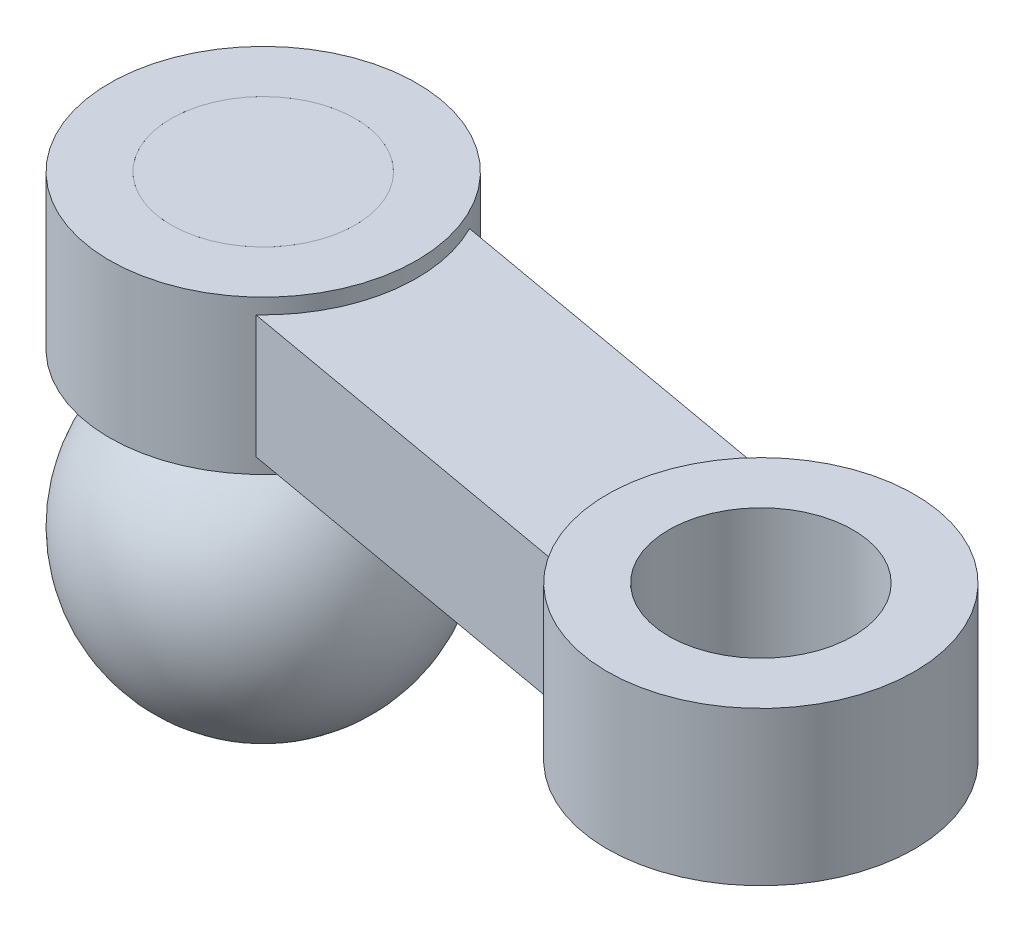
ISO-10303-21;
HEADER;
FILE_DESCRIPTION(('STEP AP214'),'2;1');
FILE_NAME('part.step','',(''),(''),'','','');
FILE_SCHEMA(('AUTOMOTIVE_DESIGN { 1 0 10303 214 1 1 1 1 }'));
ENDSEC;
DATA;
#1=APPLICATION_CONTEXT('core data for automotive mechanical design processes');
#2=APPLICATION_PROTOCOL_DEFINITION('international standard','automotive_design',2000,#1);
#3=PRODUCT_CONTEXT('',#1,'mechanical');
#4=PRODUCT('Part','Part','',(#3));
#5=PRODUCT_RELATED_PRODUCT_CATEGORY('part','',(#4));
#6=PRODUCT_DEFINITION_FORMATION('','',#4);
#7=PRODUCT_DEFINITION_CONTEXT('part definition',#1,'design');
#8=PRODUCT_DEFINITION('design','',#6,#7);
#9=PRODUCT_DEFINITION_SHAPE('','',#8);
#10=(LENGTH_UNIT() NAMED_UNIT(*) SI_UNIT(.MILLI.,.METRE.));
#11=(NAMED_UNIT(*) PLANE_ANGLE_UNIT() SI_UNIT($,.RADIAN.));
#12=(NAMED_UNIT(*) SI_UNIT($,.STERADIAN.) SOLID_ANGLE_UNIT());
#13=UNCERTAINTY_MEASURE_WITH_UNIT(LENGTH_MEASURE(1.E-05),#10,'distance_accuracy_value','');
#14=(GEOMETRIC_REPRESENTATION_CONTEXT(3) GLOBAL_UNCERTAINTY_ASSIGNED_CONTEXT((#13)) GLOBAL_UNIT_ASSIGNED_CONTEXT((#10,
#11,#12)) REPRESENTATION_CONTEXT('',''));
#15=CARTESIAN_POINT('',(0.,0.,0.));
#16=DIRECTION('',(0.,0.,1.));
#17=DIRECTION('',(1.,0.,0.));
#18=AXIS2_PLACEMENT_3D('',#15,#16,#17);
#19=CARTESIAN_POINT('',(23.1525357332202,17.893168574399,66.0663362664712));
#20=DIRECTION('',(1.,0.,0.));
#21=DIRECTION('',(0.,-1.,0.));
#22=AXIS2_PLACEMENT_3D('',#19,#20,#21);
#23=SPHERICAL_SURFACE('',#22,25.);
#24=CARTESIAN_POINT('',(23.1525357332202,17.893168574399,66.0663362664712));
#25=DIRECTION('',(0.,-1.,0.));
#26=DIRECTION('',(0.,0.,-1.));
#27=AXIS2_PLACEMENT_3D('',#24,#25,#26);
#28=SPHERICAL_SURFACE('',#27,25.);
#29=CARTESIAN_POINT('',(23.1525357332202,37.893168574399,66.0663362664712));
#30=DIRECTION('',(0.,-1.,0.));
#31=DIRECTION('',(0.,0.,-1.));
#32=AXIS2_PLACEMENT_3D('',#29,#30,#31);
#33=CIRCLE('',#32,15.);
#34=CARTESIAN_POINT('',(23.1525357332202,37.893168574399,51.0663362664712));
#35=VERTEX_POINT('',#34);
#36=EDGE_CURVE('P0_E9',#35,#35,#33,.F.);
#37=ORIENTED_EDGE('',*,*,#36,.F.);
#38=EDGE_LOOP('',(#37));
#39=FACE_BOUND('',#38,.T.);
#40=ADVANCED_FACE('P0_F14',(#39),#28,.T.);
#41=CARTESIAN_POINT('',(23.1525357332202,-7.10883142560096,66.0663362664712));
#42=DIRECTION('',(0.,1.,0.));
#43=DIRECTION('',(0.,0.,1.));
#44=AXIS2_PLACEMENT_3D('',#41,#42,#43);
#45=CYLINDRICAL_SURFACE('',#44,15.);
#46=ORIENTED_EDGE('',*,*,#36,.T.);
#47=EDGE_LOOP('',(#46));
#48=FACE_BOUND('',#47,.T.);
#49=CARTESIAN_POINT('',(23.1525357332202,67.893168574399,66.0663362664712));
#50=DIRECTION('',(0.,1.,0.));
#51=DIRECTION('',(0.,0.,1.));
#52=AXIS2_PLACEMENT_3D('',#49,#50,#51);
#53=CIRCLE('',#52,15.);
#54=CARTESIAN_POINT('',(23.1525357332202,67.893168574399,81.0663362664712));
#55=VERTEX_POINT('',#54);
#56=EDGE_CURVE('P0_E20',#55,#55,#53,.T.);
#57=ORIENTED_EDGE('',*,*,#56,.F.);
#58=EDGE_LOOP('',(#57));
#59=FACE_BOUND('',#58,.T.);
#60=ADVANCED_FACE('P0_F28',(#48,#59),#45,.T.);
#61=CARTESIAN_POINT('',(23.1525357332202,67.893168574399,66.0663362664712));
#62=DIRECTION('',(0.,1.,0.));
#63=DIRECTION('',(0.,0.,1.));
#64=AXIS2_PLACEMENT_3D('',#61,#62,#63);
#65=PLANE('',#64);
#66=ORIENTED_EDGE('',*,*,#56,.T.);
#67=EDGE_LOOP('',(#66));
#68=FACE_BOUND('',#67,.T.);
#69=ADVANCED_FACE('P0_F26',(#68),#65,.T.);
#70=CLOSED_SHELL('',(#40,#60,#69));
#71=MANIFOLD_SOLID_BREP('P0_B1',#70);
#72=CARTESIAN_POINT('',(118.995666513054,65.3931685743991,98.3013216444681));
#73=DIRECTION('',(-0.174655410865739,0.,0.984629619428199));
#74=DIRECTION('',(0.,1.,0.));
#75=AXIS2_PLACEMENT_3D('',#72,#73,#74);
#76=PLANE('',#75);
#77=DIRECTION('',(-0.984629619428199,0.,-0.174655410865739));
#78=VECTOR('',#77,1.);
#79=CARTESIAN_POINT('',(118.995666513054,45.3931685743991,98.3013216444681));
#80=LINE('',#79,#78);
#81=CARTESIAN_POINT('',(99.30307412449,45.3931685743991,94.8082134271533));
#82=VERTEX_POINT('',#81);
#83=CARTESIAN_POINT('',(40.225296958798,45.3931685743991,84.328888775209));
#84=VERTEX_POINT('',#83);
#85=EDGE_CURVE('P1_E64',#82,#84,#80,.T.);
#86=ORIENTED_EDGE('',*,*,#85,.F.);
#87=DIRECTION('',(0.,-1.,0.));
#88=VECTOR('',#87,1.);
#89=CARTESIAN_POINT('',(99.30307412449,67.893168574399,94.8082134271533));
#90=LINE('',#89,#88);
#91=CARTESIAN_POINT('',(99.30307412449,65.3931685743991,94.8082134271533));
#92=VERTEX_POINT('',#91);
#93=EDGE_CURVE('P1_E57',#82,#92,#90,.F.);
#94=ORIENTED_EDGE('',*,*,#93,.T.);
#95=DIRECTION('',(-0.984629619428199,0.,-0.174655410865739));
#96=VECTOR('',#95,1.);
#97=CARTESIAN_POINT('',(118.995666513054,65.3931685743991,98.3013216444681));
#98=LINE('',#97,#96);
#99=CARTESIAN_POINT('',(40.225296958798,65.3931685743991,84.328888775209));
#100=VERTEX_POINT('',#99);
#101=EDGE_CURVE('P1_E63',#92,#100,#98,.T.);
#102=ORIENTED_EDGE('',*,*,#101,.T.);
#103=DIRECTION('',(0.,-1.,0.));
#104=VECTOR('',#103,1.);
#105=CARTESIAN_POINT('',(40.225296958798,67.893168574399,84.328888775209));
#106=LINE('',#105,#104);
#107=EDGE_CURVE('P1_E84',#84,#100,#106,.F.);
#108=ORIENTED_EDGE('',*,*,#107,.F.);
#109=EDGE_LOOP('',(#86,#94,#102,#108));
#110=FACE_BOUND('',#109,.T.);
#111=ADVANCED_FACE('P1_F16',(#110),#76,.T.);
#112=CARTESIAN_POINT('',(124.235328839026,65.393168574399,68.7624330616222));
#113=DIRECTION('',(0.174655410865739,0.,-0.984629619428199));
#114=DIRECTION('',(0.,-1.,0.));
#115=AXIS2_PLACEMENT_3D('',#112,#113,#114);
#116=PLANE('',#115);
#117=DIRECTION('',(-0.984629619428199,0.,-0.174655410865739));
#118=VECTOR('',#117,1.);
#119=CARTESIAN_POINT('',(124.235328839026,65.393168574399,68.7624330616222));
#120=LINE('',#119,#118);
#121=CARTESIAN_POINT('',(104.542736450462,65.393168574399,65.2693248443074));
#122=VERTEX_POINT('',#121);
#123=CARTESIAN_POINT('',(45.4649592847702,65.393168574399,54.790000192363));
#124=VERTEX_POINT('',#123);
#125=EDGE_CURVE('P1_E37',#122,#124,#120,.T.);
#126=ORIENTED_EDGE('',*,*,#125,.F.);
#127=DIRECTION('',(0.,-1.,0.));
#128=VECTOR('',#127,1.);
#129=CARTESIAN_POINT('',(104.542736450462,67.893168574399,65.2693248443074));
#130=LINE('',#129,#128);
#131=CARTESIAN_POINT('',(104.542736450462,45.3931685743991,65.2693248443074));
#132=VERTEX_POINT('',#131);
#133=EDGE_CURVE('P1_E31',#122,#132,#130,.T.);
#134=ORIENTED_EDGE('',*,*,#133,.T.);
#135=DIRECTION('',(-0.984629619428199,0.,-0.174655410865739));
#136=VECTOR('',#135,1.);
#137=CARTESIAN_POINT('',(124.235328839026,45.393168574399,68.7624330616222));
#138=LINE('',#137,#136);
#139=CARTESIAN_POINT('',(45.4649592847702,45.393168574399,54.790000192363));
#140=VERTEX_POINT('',#139);
#141=EDGE_CURVE('P1_E72',#132,#140,#138,.T.);
#142=ORIENTED_EDGE('',*,*,#141,.T.);
#143=DIRECTION('',(0.,-1.,0.));
#144=VECTOR('',#143,1.);
#145=CARTESIAN_POINT('',(45.4649592847702,67.893168574399,54.790000192363));
#146=LINE('',#145,#144);
#147=EDGE_CURVE('P1_E78',#124,#140,#146,.T.);
#148=ORIENTED_EDGE('',*,*,#147,.F.);
#149=EDGE_LOOP('',(#126,#134,#142,#148));
#150=FACE_BOUND('',#149,.T.);
#151=ADVANCED_FACE('P1_F120',(#150),#116,.T.);
#152=CARTESIAN_POINT('',(23.1525357332201,67.893168574399,66.0663362664712));
#153=DIRECTION('',(0.,1.,0.));
#154=DIRECTION('',(0.174655410865739,0.,-0.984629619428199));
#155=AXIS2_PLACEMENT_3D('',#152,#153,#154);
#156=PLANE('',#155);
#157=CARTESIAN_POINT('',(23.1525357332201,67.893168574399,66.0663362664712));
#158=DIRECTION('',(0.,1.,0.));
#159=DIRECTION('',(0.174655410865739,0.,-0.984629619428199));
#160=AXIS2_PLACEMENT_3D('',#157,#158,#159);
#161=CIRCLE('',#160,25.);
#162=CARTESIAN_POINT('',(27.5189210048636,67.893168574399,41.4505957807662));
#163=VERTEX_POINT('',#162);
#164=EDGE_CURVE('P1_E24',#163,#163,#161,.T.);
#165=ORIENTED_EDGE('',*,*,#164,.T.);
#166=EDGE_LOOP('',(#165));
#167=FACE_BOUND('',#166,.T.);
#168=CARTESIAN_POINT('',(23.1525357332201,67.893168574399,66.0663362664712));
#169=DIRECTION('',(0.,1.,0.));
#170=DIRECTION('',(0.174655410865739,0.,-0.984629619428199));
#171=AXIS2_PLACEMENT_3D('',#168,#169,#170);
#172=CIRCLE('',#171,15.);
#173=CARTESIAN_POINT('',(25.7723668962062,67.893168574399,51.2968919750482));
#174=VERTEX_POINT('',#173);
#175=EDGE_CURVE('P1_E87',#174,#174,#172,.T.);
#176=ORIENTED_EDGE('',*,*,#175,.F.);
#177=EDGE_LOOP('',(#176));
#178=FACE_BOUND('',#177,.T.);
#179=ADVANCED_FACE('P1_F101',(#167,#178),#156,.T.);
#180=CARTESIAN_POINT('',(23.1525357332201,42.893168574399,66.0663362664712));
#181=DIRECTION('',(0.,1.,0.));
#182=DIRECTION('',(0.174655410865739,0.,-0.984629619428199));
#183=AXIS2_PLACEMENT_3D('',#180,#181,#182);
#184=PLANE('',#183);
#185=CARTESIAN_POINT('',(23.1525357332201,42.893168574399,66.0663362664712));
#186=DIRECTION('',(0.,1.,0.));
#187=DIRECTION('',(0.174655410865739,0.,-0.984629619428199));
#188=AXIS2_PLACEMENT_3D('',#185,#186,#187);
#189=CIRCLE('',#188,25.);
#190=CARTESIAN_POINT('',(27.5189210048636,42.893168574399,41.4505957807662));
#191=VERTEX_POINT('',#190);
#192=EDGE_CURVE('P1_E90',#191,#191,#189,.T.);
#193=ORIENTED_EDGE('',*,*,#192,.F.);
#194=EDGE_LOOP('',(#193));
#195=FACE_BOUND('',#194,.T.);
#196=CARTESIAN_POINT('',(23.1525357332201,42.893168574399,66.0663362664712));
#197=DIRECTION('',(0.,1.,0.));
#198=DIRECTION('',(0.174655410865739,0.,-0.984629619428199));
#199=AXIS2_PLACEMENT_3D('',#196,#197,#198);
#200=CIRCLE('',#199,15.);
#201=CARTESIAN_POINT('',(25.7723668962062,42.893168574399,51.2968919750482));
#202=VERTEX_POINT('',#201);
#203=EDGE_CURVE('P1_E86',#202,#202,#200,.T.);
#204=ORIENTED_EDGE('',*,*,#203,.T.);
#205=EDGE_LOOP('',(#204));
#206=FACE_BOUND('',#205,.T.);
#207=ADVANCED_FACE('P1_F98',(#195,#206),#184,.F.);
#208=CARTESIAN_POINT('',(23.1525357332201,67.893168574399,66.0663362664712));
#209=DIRECTION('',(0.,-1.,0.));
#210=DIRECTION('',(-0.174655410865739,0.,0.984629619428199));
#211=AXIS2_PLACEMENT_3D('',#208,#209,#210);
#212=CYLINDRICAL_SURFACE('',#211,25.);
#213=CARTESIAN_POINT('',(23.1525357332201,45.3931685743991,66.0663362664712));
#214=DIRECTION('',(0.,-1.,0.));
#215=DIRECTION('',(-0.174655410865739,0.,0.984629619428199));
#216=AXIS2_PLACEMENT_3D('',#213,#214,#215);
#217=CIRCLE('',#216,25.);
#218=EDGE_CURVE('P1_E81',#140,#84,#217,.T.);
#219=ORIENTED_EDGE('',*,*,#218,.T.);
#220=ORIENTED_EDGE('',*,*,#107,.T.);
#221=CARTESIAN_POINT('',(23.1525357332201,65.3931685743991,66.0663362664712));
#222=DIRECTION('',(0.,1.,0.));
#223=DIRECTION('',(0.174655410865739,0.,-0.984629619428199));
#224=AXIS2_PLACEMENT_3D('',#221,#222,#223);
#225=CIRCLE('',#224,25.);
#226=EDGE_CURVE('P1_E69',#100,#124,#225,.T.);
#227=ORIENTED_EDGE('',*,*,#226,.T.);
#228=ORIENTED_EDGE('',*,*,#147,.T.);
#229=EDGE_LOOP('',(#219,#220,#227,#228));
#230=FACE_BOUND('',#229,.T.);
#231=ORIENTED_EDGE('',*,*,#164,.F.);
#232=EDGE_LOOP('',(#231));
#233=FACE_BOUND('',#232,.T.);
#234=ORIENTED_EDGE('',*,*,#192,.T.);
#235=EDGE_LOOP('',(#234));
#236=FACE_BOUND('',#235,.T.);
#237=ADVANCED_FACE('P1_F18',(#230,#233,#236),#212,.T.);
#238=CARTESIAN_POINT('',(23.1525357332201,67.893168574399,66.0663362664712));
#239=DIRECTION('',(0.,-1.,0.));
#240=DIRECTION('',(-0.174655410865739,0.,0.984629619428199));
#241=AXIS2_PLACEMENT_3D('',#238,#239,#240);
#242=CYLINDRICAL_SURFACE('',#241,15.);
#243=ORIENTED_EDGE('',*,*,#175,.T.);
#244=EDGE_LOOP('',(#243));
#245=FACE_BOUND('',#244,.T.);
#246=ORIENTED_EDGE('',*,*,#203,.F.);
#247=EDGE_LOOP('',(#246));
#248=FACE_BOUND('',#247,.T.);
#249=ADVANCED_FACE('P1_F104',(#245,#248),#242,.F.);
#250=CARTESIAN_POINT('',(124.235328839026,45.393168574399,68.7624330616222));
#251=DIRECTION('',(0.,-1.,0.));
#252=DIRECTION('',(-0.174655410865739,0.,0.984629619428199));
#253=AXIS2_PLACEMENT_3D('',#250,#251,#252);
#254=PLANE('',#253);
#255=ORIENTED_EDGE('',*,*,#141,.F.);
#256=CARTESIAN_POINT('',(121.61549767604,45.3931685743991,83.5318773530451));
#257=DIRECTION('',(0.,-1.,0.));
#258=DIRECTION('',(-0.174655410865739,0.,0.984629619428199));
#259=AXIS2_PLACEMENT_3D('',#256,#257,#258);
#260=CIRCLE('',#259,25.);
#261=EDGE_CURVE('P1_E65',#132,#82,#260,.F.);
#262=ORIENTED_EDGE('',*,*,#261,.T.);
#263=ORIENTED_EDGE('',*,*,#85,.T.);
#264=ORIENTED_EDGE('',*,*,#218,.F.);
#265=EDGE_LOOP('',(#255,#262,#263,#264));
#266=FACE_BOUND('',#265,.T.);
#267=ADVANCED_FACE('P1_F106',(#266),#254,.T.);
#268=CARTESIAN_POINT('',(124.235328839026,65.393168574399,68.7624330616222));
#269=DIRECTION('',(0.,1.,0.));
#270=DIRECTION('',(0.174655410865739,0.,-0.984629619428199));
#271=AXIS2_PLACEMENT_3D('',#268,#269,#270);
#272=PLANE('',#271);
#273=ORIENTED_EDGE('',*,*,#101,.F.);
#274=CARTESIAN_POINT('',(121.61549767604,65.3931685743991,83.5318773530451));
#275=DIRECTION('',(0.,1.,0.));
#276=DIRECTION('',(0.174655410865739,0.,-0.984629619428199));
#277=AXIS2_PLACEMENT_3D('',#274,#275,#276);
#278=CIRCLE('',#277,25.);
#279=EDGE_CURVE('P1_E10',#92,#122,#278,.F.);
#280=ORIENTED_EDGE('',*,*,#279,.T.);
#281=ORIENTED_EDGE('',*,*,#125,.T.);
#282=ORIENTED_EDGE('',*,*,#226,.F.);
#283=EDGE_LOOP('',(#273,#280,#281,#282));
#284=FACE_BOUND('',#283,.T.);
#285=ADVANCED_FACE('P1_F67',(#284),#272,.T.);
#286=CARTESIAN_POINT('',(121.61549767604,67.893168574399,83.5318773530451));
#287=DIRECTION('',(0.,-1.,0.));
#288=DIRECTION('',(-0.174655410865739,0.,0.984629619428199));
#289=AXIS2_PLACEMENT_3D('',#286,#287,#288);
#290=CYLINDRICAL_SURFACE('',#289,15.);
#291=CARTESIAN_POINT('',(121.61549767604,42.893168574399,83.5318773530451));
#292=DIRECTION('',(0.,1.,0.));
#293=DIRECTION('',(0.174655410865739,0.,-0.984629619428199));
#294=AXIS2_PLACEMENT_3D('',#291,#292,#293);
#295=CIRCLE('',#294,15.);
#296=CARTESIAN_POINT('',(124.235328839026,42.893168574399,68.7624330616222));
#297=VERTEX_POINT('',#296);
#298=EDGE_CURVE('P1_E147',#297,#297,#295,.T.);
#299=ORIENTED_EDGE('',*,*,#298,.F.);
#300=EDGE_LOOP('',(#299));
#301=FACE_BOUND('',#300,.T.);
#302=CARTESIAN_POINT('',(121.61549767604,67.893168574399,83.5318773530451));
#303=DIRECTION('',(0.,1.,0.));
#304=DIRECTION('',(0.174655410865739,0.,-0.984629619428199));
#305=AXIS2_PLACEMENT_3D('',#302,#303,#304);
#306=CIRCLE('',#305,15.);
#307=CARTESIAN_POINT('',(124.235328839026,67.893168574399,68.7624330616222));
#308=VERTEX_POINT('',#307);
#309=EDGE_CURVE('P1_E150',#308,#308,#306,.T.);
#310=ORIENTED_EDGE('',*,*,#309,.T.);
#311=EDGE_LOOP('',(#310));
#312=FACE_BOUND('',#311,.T.);
#313=ADVANCED_FACE('P1_F128',(#301,#312),#290,.F.);
#314=CARTESIAN_POINT('',(121.61549767604,67.893168574399,83.5318773530451));
#315=DIRECTION('',(0.,1.,0.));
#316=DIRECTION('',(0.174655410865739,0.,-0.984629619428199));
#317=AXIS2_PLACEMENT_3D('',#314,#315,#316);
#318=PLANE('',#317);
#319=CARTESIAN_POINT('',(121.61549767604,67.893168574399,83.5318773530451));
#320=DIRECTION('',(0.,1.,0.));
#321=DIRECTION('',(0.174655410865739,0.,-0.984629619428199));
#322=AXIS2_PLACEMENT_3D('',#319,#320,#321);
#323=CIRCLE('',#322,25.);
#324=CARTESIAN_POINT('',(125.981882947684,67.893168574399,58.9161368673402));
#325=VERTEX_POINT('',#324);
#326=EDGE_CURVE('P1_E155',#325,#325,#323,.T.);
#327=ORIENTED_EDGE('',*,*,#326,.T.);
#328=EDGE_LOOP('',(#327));
#329=FACE_BOUND('',#328,.T.);
#330=ORIENTED_EDGE('',*,*,#309,.F.);
#331=EDGE_LOOP('',(#330));
#332=FACE_BOUND('',#331,.T.);
#333=ADVANCED_FACE('P1_F135',(#329,#332),#318,.T.);
#334=CARTESIAN_POINT('',(121.61549767604,42.893168574399,83.5318773530451));
#335=DIRECTION('',(0.,1.,0.));
#336=DIRECTION('',(0.174655410865739,0.,-0.984629619428199));
#337=AXIS2_PLACEMENT_3D('',#334,#335,#336);
#338=PLANE('',#337);
#339=CARTESIAN_POINT('',(121.61549767604,42.893168574399,83.5318773530451));
#340=DIRECTION('',(0.,1.,0.));
#341=DIRECTION('',(0.174655410865739,0.,-0.984629619428199));
#342=AXIS2_PLACEMENT_3D('',#339,#340,#341);
#343=CIRCLE('',#342,25.);
#344=CARTESIAN_POINT('',(125.981882947684,42.893168574399,58.9161368673402));
#345=VERTEX_POINT('',#344);
#346=EDGE_CURVE('P1_E152',#345,#345,#343,.T.);
#347=ORIENTED_EDGE('',*,*,#346,.F.);
#348=EDGE_LOOP('',(#347));
#349=FACE_BOUND('',#348,.T.);
#350=ORIENTED_EDGE('',*,*,#298,.T.);
#351=EDGE_LOOP('',(#350));
#352=FACE_BOUND('',#351,.T.);
#353=ADVANCED_FACE('P1_F132',(#349,#352),#338,.F.);
#354=CARTESIAN_POINT('',(121.61549767604,67.893168574399,83.5318773530451));
#355=DIRECTION('',(0.,-1.,0.));
#356=DIRECTION('',(-0.174655410865739,0.,0.984629619428199));
#357=AXIS2_PLACEMENT_3D('',#354,#355,#356);
#358=CYLINDRICAL_SURFACE('',#357,25.);
#359=ORIENTED_EDGE('',*,*,#261,.F.);
#360=ORIENTED_EDGE('',*,*,#133,.F.);
#361=ORIENTED_EDGE('',*,*,#279,.F.);
#362=ORIENTED_EDGE('',*,*,#93,.F.);
#363=EDGE_LOOP('',(#359,#360,#361,#362));
#364=FACE_BOUND('',#363,.T.);
#365=ORIENTED_EDGE('',*,*,#326,.F.);
#366=EDGE_LOOP('',(#365));
#367=FACE_BOUND('',#366,.T.);
#368=ORIENTED_EDGE('',*,*,#346,.T.);
#369=EDGE_LOOP('',(#368));
#370=FACE_BOUND('',#369,.T.);
#371=ADVANCED_FACE('P1_F55',(#364,#367,#370),#358,.T.);
#372=CLOSED_SHELL('',(#111,#151,#179,#207,#237,#249,#267,#285,#313,#333,#353,#371));
#373=MANIFOLD_SOLID_BREP('P1_B1',#372);
#374=ADVANCED_BREP_SHAPE_REPRESENTATION('',(#18,#71,#373),#14);
#375=SHAPE_DEFINITION_REPRESENTATION(#9,#374);
ENDSEC;
END-ISO-10303-21;
